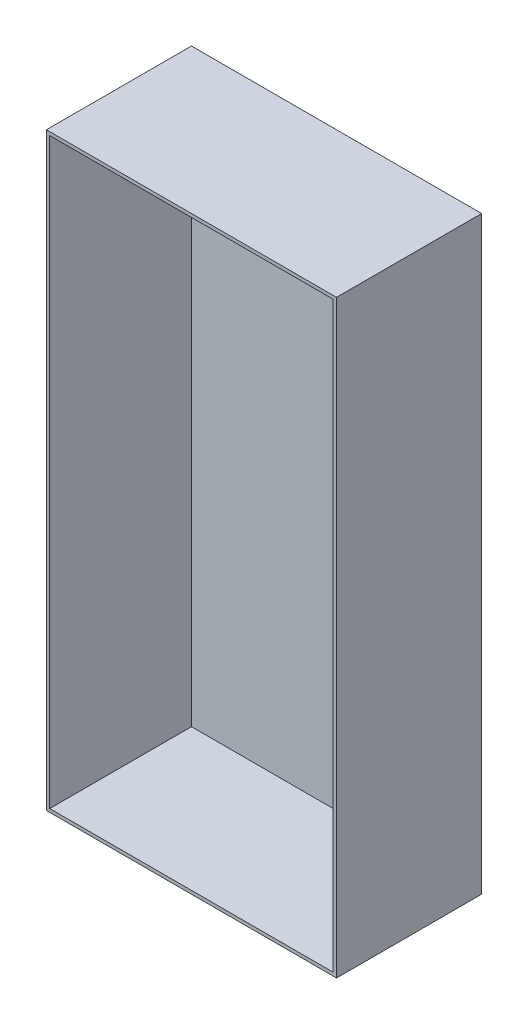
ISO-10303-21;
HEADER;
FILE_DESCRIPTION(('STEP AP214'),'2;1');
FILE_NAME('part.step','',(''),(''),'','','');
FILE_SCHEMA(('AUTOMOTIVE_DESIGN { 1 0 10303 214 1 1 1 1 }'));
ENDSEC;
DATA;
#1=APPLICATION_CONTEXT('core data for automotive mechanical design processes');
#2=APPLICATION_PROTOCOL_DEFINITION('international standard','automotive_design',2000,#1);
#3=PRODUCT_CONTEXT('',#1,'mechanical');
#4=PRODUCT('Part','Part','',(#3));
#5=PRODUCT_RELATED_PRODUCT_CATEGORY('part','',(#4));
#6=PRODUCT_DEFINITION_FORMATION('','',#4);
#7=PRODUCT_DEFINITION_CONTEXT('part definition',#1,'design');
#8=PRODUCT_DEFINITION('design','',#6,#7);
#9=PRODUCT_DEFINITION_SHAPE('','',#8);
#10=(LENGTH_UNIT() NAMED_UNIT(*) SI_UNIT(.MILLI.,.METRE.));
#11=(NAMED_UNIT(*) PLANE_ANGLE_UNIT() SI_UNIT($,.RADIAN.));
#12=(NAMED_UNIT(*) SI_UNIT($,.STERADIAN.) SOLID_ANGLE_UNIT());
#13=UNCERTAINTY_MEASURE_WITH_UNIT(LENGTH_MEASURE(1.E-05),#10,'distance_accuracy_value','');
#14=(GEOMETRIC_REPRESENTATION_CONTEXT(3) GLOBAL_UNCERTAINTY_ASSIGNED_CONTEXT((#13)) GLOBAL_UNIT_ASSIGNED_CONTEXT((#10,
#11,#12)) REPRESENTATION_CONTEXT('',''));
#15=CARTESIAN_POINT('',(0.,0.,0.));
#16=DIRECTION('',(0.,0.,1.));
#17=DIRECTION('',(1.,0.,0.));
#18=AXIS2_PLACEMENT_3D('',#15,#16,#17);
#19=CARTESIAN_POINT('',(-50.,-176.75,87.));
#20=DIRECTION('',(0.,1.,0.));
#21=DIRECTION('',(-1.,0.,0.));
#22=AXIS2_PLACEMENT_3D('',#19,#20,#21);
#23=PLANE('',#22);
#24=DIRECTION('',(1.,0.,0.));
#25=VECTOR('',#24,1.);
#26=CARTESIAN_POINT('',(-50.,-176.75,0.));
#27=LINE('',#26,#25);
#28=CARTESIAN_POINT('',(-50.,-176.75,0.));
#29=VERTEX_POINT('',#28);
#30=CARTESIAN_POINT('',(124.,-176.75,0.));
#31=VERTEX_POINT('',#30);
#32=EDGE_CURVE('E173',#29,#31,#27,.T.);
#33=ORIENTED_EDGE('',*,*,#32,.T.);
#34=DIRECTION('',(0.,0.,-1.));
#35=VECTOR('',#34,1.);
#36=CARTESIAN_POINT('',(124.,-176.75,87.));
#37=LINE('',#36,#35);
#38=CARTESIAN_POINT('',(124.,-176.75,87.));
#39=VERTEX_POINT('',#38);
#40=EDGE_CURVE('E11',#39,#31,#37,.T.);
#41=ORIENTED_EDGE('',*,*,#40,.F.);
#42=DIRECTION('',(1.,0.,0.));
#43=VECTOR('',#42,1.);
#44=CARTESIAN_POINT('',(-50.,-176.75,87.));
#45=LINE('',#44,#43);
#46=CARTESIAN_POINT('',(-50.,-176.75,87.));
#47=VERTEX_POINT('',#46);
#48=EDGE_CURVE('E162',#47,#39,#45,.T.);
#49=ORIENTED_EDGE('',*,*,#48,.F.);
#50=DIRECTION('',(0.,0.,-1.));
#51=VECTOR('',#50,1.);
#52=CARTESIAN_POINT('',(-50.,-176.75,87.));
#53=LINE('',#52,#51);
#54=EDGE_CURVE('E172',#47,#29,#53,.T.);
#55=ORIENTED_EDGE('',*,*,#54,.T.);
#56=EDGE_LOOP('',(#33,#41,#49,#55));
#57=FACE_BOUND('',#56,.T.);
#58=ADVANCED_FACE('F45',(#57),#23,.F.);
#59=CARTESIAN_POINT('',(124.,-176.75,87.));
#60=DIRECTION('',(-1.,0.,0.));
#61=DIRECTION('',(0.,0.,1.));
#62=AXIS2_PLACEMENT_3D('',#59,#60,#61);
#63=PLANE('',#62);
#64=DIRECTION('',(0.,1.,0.));
#65=VECTOR('',#64,1.);
#66=CARTESIAN_POINT('',(124.,-176.75,0.));
#67=LINE('',#66,#65);
#68=CARTESIAN_POINT('',(124.,176.75,0.));
#69=VERTEX_POINT('',#68);
#70=EDGE_CURVE('E177',#31,#69,#67,.T.);
#71=ORIENTED_EDGE('',*,*,#70,.T.);
#72=DIRECTION('',(0.,0.,-1.));
#73=VECTOR('',#72,1.);
#74=CARTESIAN_POINT('',(124.,176.75,87.));
#75=LINE('',#74,#73);
#76=CARTESIAN_POINT('',(124.,176.75,87.));
#77=VERTEX_POINT('',#76);
#78=EDGE_CURVE('E53',#77,#69,#75,.T.);
#79=ORIENTED_EDGE('',*,*,#78,.F.);
#80=DIRECTION('',(0.,1.,0.));
#81=VECTOR('',#80,1.);
#82=CARTESIAN_POINT('',(124.,-176.75,87.));
#83=LINE('',#82,#81);
#84=EDGE_CURVE('E97',#39,#77,#83,.T.);
#85=ORIENTED_EDGE('',*,*,#84,.F.);
#86=ORIENTED_EDGE('',*,*,#40,.T.);
#87=EDGE_LOOP('',(#71,#79,#85,#86));
#88=FACE_BOUND('',#87,.T.);
#89=ADVANCED_FACE('F213',(#88),#63,.F.);
#90=CARTESIAN_POINT('',(-50.,176.75,87.));
#91=DIRECTION('',(0.,-1.,0.));
#92=DIRECTION('',(1.,0.,0.));
#93=AXIS2_PLACEMENT_3D('',#90,#91,#92);
#94=PLANE('',#93);
#95=DIRECTION('',(-1.,0.,0.));
#96=VECTOR('',#95,1.);
#97=CARTESIAN_POINT('',(-50.,176.75,0.));
#98=LINE('',#97,#96);
#99=CARTESIAN_POINT('',(-50.,176.75,0.));
#100=VERTEX_POINT('',#99);
#101=EDGE_CURVE('E180',#69,#100,#98,.T.);
#102=ORIENTED_EDGE('',*,*,#101,.T.);
#103=DIRECTION('',(0.,0.,-1.));
#104=VECTOR('',#103,1.);
#105=CARTESIAN_POINT('',(-50.,176.75,87.));
#106=LINE('',#105,#104);
#107=CARTESIAN_POINT('',(-50.,176.75,87.));
#108=VERTEX_POINT('',#107);
#109=EDGE_CURVE('E187',#108,#100,#106,.T.);
#110=ORIENTED_EDGE('',*,*,#109,.F.);
#111=DIRECTION('',(-1.,0.,0.));
#112=VECTOR('',#111,1.);
#113=CARTESIAN_POINT('',(-50.,176.75,87.));
#114=LINE('',#113,#112);
#115=EDGE_CURVE('E167',#77,#108,#114,.T.);
#116=ORIENTED_EDGE('',*,*,#115,.F.);
#117=ORIENTED_EDGE('',*,*,#78,.T.);
#118=EDGE_LOOP('',(#102,#110,#116,#117));
#119=FACE_BOUND('',#118,.T.);
#120=ADVANCED_FACE('F194',(#119),#94,.F.);
#121=CARTESIAN_POINT('',(-50.,-176.75,87.));
#122=DIRECTION('',(1.,0.,0.));
#123=DIRECTION('',(0.,1.,0.));
#124=AXIS2_PLACEMENT_3D('',#121,#122,#123);
#125=PLANE('',#124);
#126=DIRECTION('',(0.,-1.,0.));
#127=VECTOR('',#126,1.);
#128=CARTESIAN_POINT('',(-50.,-176.75,0.));
#129=LINE('',#128,#127);
#130=EDGE_CURVE('E90',#100,#29,#129,.T.);
#131=ORIENTED_EDGE('',*,*,#130,.T.);
#132=ORIENTED_EDGE('',*,*,#54,.F.);
#133=DIRECTION('',(0.,-1.,0.));
#134=VECTOR('',#133,1.);
#135=CARTESIAN_POINT('',(-50.,-176.75,87.));
#136=LINE('',#135,#134);
#137=EDGE_CURVE('E69',#108,#47,#136,.T.);
#138=ORIENTED_EDGE('',*,*,#137,.F.);
#139=ORIENTED_EDGE('',*,*,#109,.T.);
#140=EDGE_LOOP('',(#131,#132,#138,#139));
#141=FACE_BOUND('',#140,.T.);
#142=ADVANCED_FACE('F202',(#141),#125,.F.);
#143=CARTESIAN_POINT('',(0.,0.,87.));
#144=DIRECTION('',(0.,0.,1.));
#145=DIRECTION('',(1.,0.,0.));
#146=AXIS2_PLACEMENT_3D('',#143,#144,#145);
#147=PLANE('',#146);
#148=DIRECTION('',(1.,0.,0.));
#149=VECTOR('',#148,1.);
#150=CARTESIAN_POINT('',(-50.,-174.75,87.));
#151=LINE('',#150,#149);
#152=CARTESIAN_POINT('',(-48.,-174.75,87.));
#153=VERTEX_POINT('',#152);
#154=CARTESIAN_POINT('',(122.,-174.75,87.));
#155=VERTEX_POINT('',#154);
#156=EDGE_CURVE('E146',#153,#155,#151,.T.);
#157=ORIENTED_EDGE('',*,*,#156,.F.);
#158=DIRECTION('',(0.,-1.,0.));
#159=VECTOR('',#158,1.);
#160=CARTESIAN_POINT('',(-48.,-176.75,87.));
#161=LINE('',#160,#159);
#162=CARTESIAN_POINT('',(-48.,174.75,87.));
#163=VERTEX_POINT('',#162);
#164=EDGE_CURVE('E159',#163,#153,#161,.T.);
#165=ORIENTED_EDGE('',*,*,#164,.F.);
#166=DIRECTION('',(-1.,0.,0.));
#167=VECTOR('',#166,1.);
#168=CARTESIAN_POINT('',(-50.,174.75,87.));
#169=LINE('',#168,#167);
#170=CARTESIAN_POINT('',(122.,174.75,87.));
#171=VERTEX_POINT('',#170);
#172=EDGE_CURVE('E156',#171,#163,#169,.T.);
#173=ORIENTED_EDGE('',*,*,#172,.F.);
#174=DIRECTION('',(0.,1.,0.));
#175=VECTOR('',#174,1.);
#176=CARTESIAN_POINT('',(122.,-176.75,87.));
#177=LINE('',#176,#175);
#178=EDGE_CURVE('E135',#155,#171,#177,.T.);
#179=ORIENTED_EDGE('',*,*,#178,.F.);
#180=EDGE_LOOP('',(#157,#165,#173,#179));
#181=FACE_BOUND('',#180,.T.);
#182=ORIENTED_EDGE('',*,*,#48,.T.);
#183=ORIENTED_EDGE('',*,*,#84,.T.);
#184=ORIENTED_EDGE('',*,*,#115,.T.);
#185=ORIENTED_EDGE('',*,*,#137,.T.);
#186=EDGE_LOOP('',(#182,#183,#184,#185));
#187=FACE_BOUND('',#186,.T.);
#188=ADVANCED_FACE('F204',(#181,#187),#147,.T.);
#189=CARTESIAN_POINT('',(0.,0.,0.));
#190=DIRECTION('',(0.,0.,1.));
#191=DIRECTION('',(1.,0.,0.));
#192=AXIS2_PLACEMENT_3D('',#189,#190,#191);
#193=PLANE('',#192);
#194=ORIENTED_EDGE('',*,*,#32,.F.);
#195=ORIENTED_EDGE('',*,*,#130,.F.);
#196=ORIENTED_EDGE('',*,*,#101,.F.);
#197=ORIENTED_EDGE('',*,*,#70,.F.);
#198=EDGE_LOOP('',(#194,#195,#196,#197));
#199=FACE_BOUND('',#198,.T.);
#200=ADVANCED_FACE('F198',(#199),#193,.F.);
#201=CARTESIAN_POINT('',(-50.,-174.75,87.));
#202=DIRECTION('',(0.,1.,0.));
#203=DIRECTION('',(-1.,0.,0.));
#204=AXIS2_PLACEMENT_3D('',#201,#202,#203);
#205=PLANE('',#204);
#206=DIRECTION('',(1.,0.,0.));
#207=VECTOR('',#206,1.);
#208=CARTESIAN_POINT('',(-50.,-174.75,2.));
#209=LINE('',#208,#207);
#210=CARTESIAN_POINT('',(-48.,-174.75,2.));
#211=VERTEX_POINT('',#210);
#212=CARTESIAN_POINT('',(122.,-174.75,2.));
#213=VERTEX_POINT('',#212);
#214=EDGE_CURVE('E125',#211,#213,#209,.T.);
#215=ORIENTED_EDGE('',*,*,#214,.F.);
#216=DIRECTION('',(0.,0.,-1.));
#217=VECTOR('',#216,1.);
#218=CARTESIAN_POINT('',(-48.,-174.75,87.));
#219=LINE('',#218,#217);
#220=EDGE_CURVE('E150',#153,#211,#219,.T.);
#221=ORIENTED_EDGE('',*,*,#220,.F.);
#222=ORIENTED_EDGE('',*,*,#156,.T.);
#223=DIRECTION('',(0.,0.,-1.));
#224=VECTOR('',#223,1.);
#225=CARTESIAN_POINT('',(122.,-174.75,87.));
#226=LINE('',#225,#224);
#227=EDGE_CURVE('E139',#155,#213,#226,.T.);
#228=ORIENTED_EDGE('',*,*,#227,.T.);
#229=EDGE_LOOP('',(#215,#221,#222,#228));
#230=FACE_BOUND('',#229,.T.);
#231=ADVANCED_FACE('F247',(#230),#205,.T.);
#232=CARTESIAN_POINT('',(122.,-176.75,87.));
#233=DIRECTION('',(-1.,0.,0.));
#234=DIRECTION('',(0.,0.,1.));
#235=AXIS2_PLACEMENT_3D('',#232,#233,#234);
#236=PLANE('',#235);
#237=DIRECTION('',(0.,1.,0.));
#238=VECTOR('',#237,1.);
#239=CARTESIAN_POINT('',(122.,-176.75,2.));
#240=LINE('',#239,#238);
#241=CARTESIAN_POINT('',(122.,174.75,2.));
#242=VERTEX_POINT('',#241);
#243=EDGE_CURVE('E119',#213,#242,#240,.T.);
#244=ORIENTED_EDGE('',*,*,#243,.F.);
#245=ORIENTED_EDGE('',*,*,#227,.F.);
#246=ORIENTED_EDGE('',*,*,#178,.T.);
#247=DIRECTION('',(0.,0.,-1.));
#248=VECTOR('',#247,1.);
#249=CARTESIAN_POINT('',(122.,174.75,87.));
#250=LINE('',#249,#248);
#251=EDGE_CURVE('E132',#171,#242,#250,.T.);
#252=ORIENTED_EDGE('',*,*,#251,.T.);
#253=EDGE_LOOP('',(#244,#245,#246,#252));
#254=FACE_BOUND('',#253,.T.);
#255=ADVANCED_FACE('F133',(#254),#236,.T.);
#256=CARTESIAN_POINT('',(-50.,174.75,87.));
#257=DIRECTION('',(0.,-1.,0.));
#258=DIRECTION('',(1.,0.,0.));
#259=AXIS2_PLACEMENT_3D('',#256,#257,#258);
#260=PLANE('',#259);
#261=DIRECTION('',(-1.,0.,0.));
#262=VECTOR('',#261,1.);
#263=CARTESIAN_POINT('',(-50.,174.75,2.));
#264=LINE('',#263,#262);
#265=CARTESIAN_POINT('',(-48.,174.75,2.));
#266=VERTEX_POINT('',#265);
#267=EDGE_CURVE('E123',#242,#266,#264,.T.);
#268=ORIENTED_EDGE('',*,*,#267,.F.);
#269=ORIENTED_EDGE('',*,*,#251,.F.);
#270=ORIENTED_EDGE('',*,*,#172,.T.);
#271=DIRECTION('',(0.,0.,-1.));
#272=VECTOR('',#271,1.);
#273=CARTESIAN_POINT('',(-48.,174.75,87.));
#274=LINE('',#273,#272);
#275=EDGE_CURVE('E60',#163,#266,#274,.T.);
#276=ORIENTED_EDGE('',*,*,#275,.T.);
#277=EDGE_LOOP('',(#268,#269,#270,#276));
#278=FACE_BOUND('',#277,.T.);
#279=ADVANCED_FACE('F141',(#278),#260,.T.);
#280=CARTESIAN_POINT('',(-48.,-176.75,87.));
#281=DIRECTION('',(1.,0.,0.));
#282=DIRECTION('',(0.,1.,0.));
#283=AXIS2_PLACEMENT_3D('',#280,#281,#282);
#284=PLANE('',#283);
#285=DIRECTION('',(0.,-1.,0.));
#286=VECTOR('',#285,1.);
#287=CARTESIAN_POINT('',(-48.,-176.75,2.));
#288=LINE('',#287,#286);
#289=EDGE_CURVE('E143',#266,#211,#288,.T.);
#290=ORIENTED_EDGE('',*,*,#289,.F.);
#291=ORIENTED_EDGE('',*,*,#275,.F.);
#292=ORIENTED_EDGE('',*,*,#164,.T.);
#293=ORIENTED_EDGE('',*,*,#220,.T.);
#294=EDGE_LOOP('',(#290,#291,#292,#293));
#295=FACE_BOUND('',#294,.T.);
#296=ADVANCED_FACE('F271',(#295),#284,.T.);
#297=CARTESIAN_POINT('',(0.,0.,2.));
#298=DIRECTION('',(0.,0.,1.));
#299=DIRECTION('',(1.,0.,0.));
#300=AXIS2_PLACEMENT_3D('',#297,#298,#299);
#301=PLANE('',#300);
#302=ORIENTED_EDGE('',*,*,#214,.T.);
#303=ORIENTED_EDGE('',*,*,#243,.T.);
#304=ORIENTED_EDGE('',*,*,#267,.T.);
#305=ORIENTED_EDGE('',*,*,#289,.T.);
#306=EDGE_LOOP('',(#302,#303,#304,#305));
#307=FACE_BOUND('',#306,.T.);
#308=ADVANCED_FACE('F121',(#307),#301,.T.);
#309=CLOSED_SHELL('',(#58,#89,#120,#142,#188,#200,#231,#255,#279,#296,#308));
#310=MANIFOLD_SOLID_BREP('B2',#309);
#311=ADVANCED_BREP_SHAPE_REPRESENTATION('',(#18,#310),#14);
#312=SHAPE_DEFINITION_REPRESENTATION(#9,#311);
ENDSEC;
END-ISO-10303-21;
